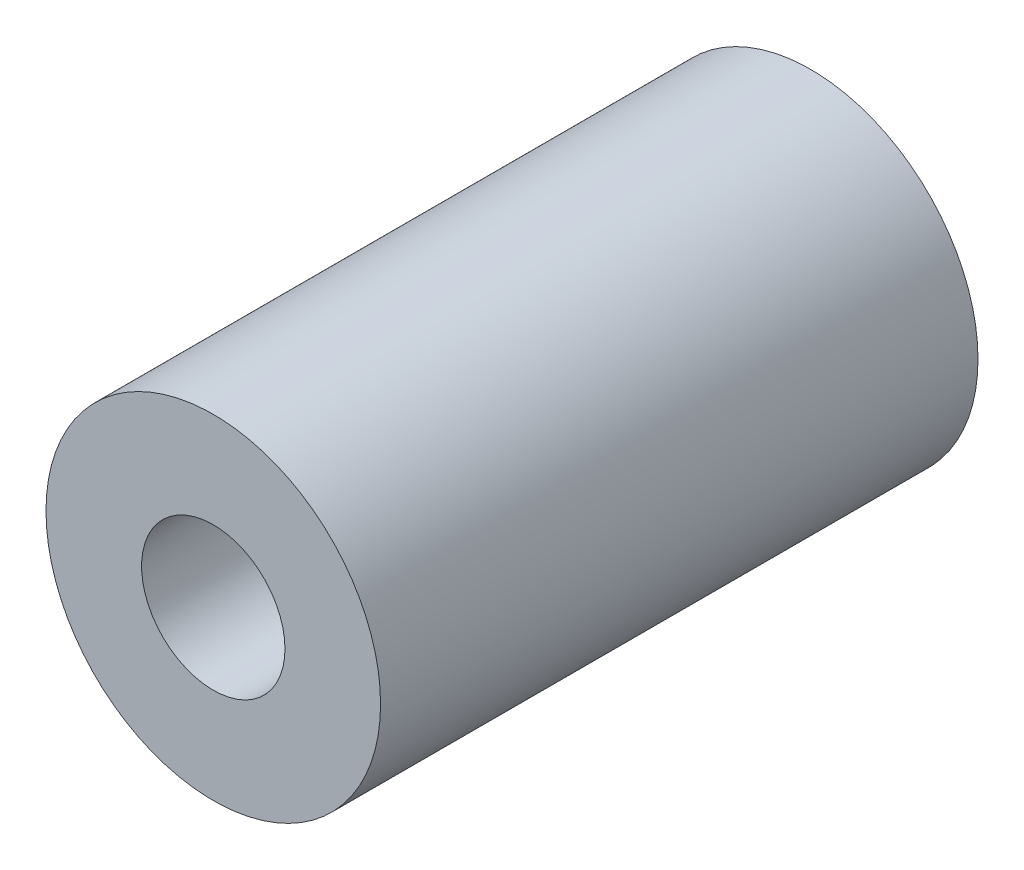
ISO-10303-21;
HEADER;
FILE_DESCRIPTION(('STEP AP214'),'2;1');
FILE_NAME('part.step','',(''),(''),'','','');
FILE_SCHEMA(('AUTOMOTIVE_DESIGN { 1 0 10303 214 1 1 1 1 }'));
ENDSEC;
DATA;
#1=APPLICATION_CONTEXT('core data for automotive mechanical design processes');
#2=APPLICATION_PROTOCOL_DEFINITION('international standard','automotive_design',2000,#1);
#3=PRODUCT_CONTEXT('',#1,'mechanical');
#4=PRODUCT('Part','Part','',(#3));
#5=PRODUCT_RELATED_PRODUCT_CATEGORY('part','',(#4));
#6=PRODUCT_DEFINITION_FORMATION('','',#4);
#7=PRODUCT_DEFINITION_CONTEXT('part definition',#1,'design');
#8=PRODUCT_DEFINITION('design','',#6,#7);
#9=PRODUCT_DEFINITION_SHAPE('','',#8);
#10=(LENGTH_UNIT() NAMED_UNIT(*) SI_UNIT(.MILLI.,.METRE.));
#11=(NAMED_UNIT(*) PLANE_ANGLE_UNIT() SI_UNIT($,.RADIAN.));
#12=(NAMED_UNIT(*) SI_UNIT($,.STERADIAN.) SOLID_ANGLE_UNIT());
#13=UNCERTAINTY_MEASURE_WITH_UNIT(LENGTH_MEASURE(1.E-05),#10,'distance_accuracy_value','');
#14=(GEOMETRIC_REPRESENTATION_CONTEXT(3) GLOBAL_UNCERTAINTY_ASSIGNED_CONTEXT((#13)) GLOBAL_UNIT_ASSIGNED_CONTEXT((#10,
#11,#12)) REPRESENTATION_CONTEXT('',''));
#15=CARTESIAN_POINT('',(0.,0.,0.));
#16=DIRECTION('',(0.,0.,1.));
#17=DIRECTION('',(1.,0.,0.));
#18=AXIS2_PLACEMENT_3D('',#15,#16,#17);
#19=CARTESIAN_POINT('',(0.,0.,25.));
#20=DIRECTION('',(0.,0.,1.));
#21=DIRECTION('',(1.,0.,0.));
#22=AXIS2_PLACEMENT_3D('',#19,#20,#21);
#23=PLANE('',#22);
#24=CARTESIAN_POINT('',(0.,0.,25.));
#25=DIRECTION('',(0.,0.,1.));
#26=DIRECTION('',(1.,0.,0.));
#27=AXIS2_PLACEMENT_3D('',#24,#25,#26);
#28=CIRCLE('',#27,7.);
#29=CARTESIAN_POINT('',(7.,0.,25.));
#30=VERTEX_POINT('',#29);
#31=EDGE_CURVE('E10',#30,#30,#28,.T.);
#32=ORIENTED_EDGE('',*,*,#31,.T.);
#33=EDGE_LOOP('',(#32));
#34=FACE_BOUND('',#33,.T.);
#35=CARTESIAN_POINT('',(0.,0.,25.));
#36=DIRECTION('',(0.,0.,1.));
#37=DIRECTION('',(1.,0.,0.));
#38=AXIS2_PLACEMENT_3D('',#35,#36,#37);
#39=CIRCLE('',#38,3.);
#40=CARTESIAN_POINT('',(3.,0.,25.));
#41=VERTEX_POINT('',#40);
#42=EDGE_CURVE('E45',#41,#41,#39,.T.);
#43=ORIENTED_EDGE('',*,*,#42,.F.);
#44=EDGE_LOOP('',(#43));
#45=FACE_BOUND('',#44,.T.);
#46=ADVANCED_FACE('F34',(#34,#45),#23,.T.);
#47=CARTESIAN_POINT('',(0.,0.,0.));
#48=DIRECTION('',(0.,0.,1.));
#49=DIRECTION('',(1.,0.,0.));
#50=AXIS2_PLACEMENT_3D('',#47,#48,#49);
#51=PLANE('',#50);
#52=CARTESIAN_POINT('',(0.,0.,0.));
#53=DIRECTION('',(0.,0.,1.));
#54=DIRECTION('',(1.,0.,0.));
#55=AXIS2_PLACEMENT_3D('',#52,#53,#54);
#56=CIRCLE('',#55,7.);
#57=CARTESIAN_POINT('',(7.,0.,0.));
#58=VERTEX_POINT('',#57);
#59=EDGE_CURVE('E38',#58,#58,#56,.T.);
#60=ORIENTED_EDGE('',*,*,#59,.F.);
#61=EDGE_LOOP('',(#60));
#62=FACE_BOUND('',#61,.T.);
#63=CARTESIAN_POINT('',(0.,0.,0.));
#64=DIRECTION('',(0.,0.,1.));
#65=DIRECTION('',(1.,0.,0.));
#66=AXIS2_PLACEMENT_3D('',#63,#64,#65);
#67=CIRCLE('',#66,3.);
#68=CARTESIAN_POINT('',(3.,0.,0.));
#69=VERTEX_POINT('',#68);
#70=EDGE_CURVE('E47',#69,#69,#67,.T.);
#71=ORIENTED_EDGE('',*,*,#70,.T.);
#72=EDGE_LOOP('',(#71));
#73=FACE_BOUND('',#72,.T.);
#74=ADVANCED_FACE('F57',(#62,#73),#51,.F.);
#75=CARTESIAN_POINT('',(0.,0.,25.));
#76=DIRECTION('',(0.,0.,-1.));
#77=DIRECTION('',(-1.,0.,0.));
#78=AXIS2_PLACEMENT_3D('',#75,#76,#77);
#79=CYLINDRICAL_SURFACE('',#78,7.);
#80=ORIENTED_EDGE('',*,*,#31,.F.);
#81=EDGE_LOOP('',(#80));
#82=FACE_BOUND('',#81,.T.);
#83=ORIENTED_EDGE('',*,*,#59,.T.);
#84=EDGE_LOOP('',(#83));
#85=FACE_BOUND('',#84,.T.);
#86=ADVANCED_FACE('F36',(#82,#85),#79,.T.);
#87=CARTESIAN_POINT('',(0.,0.,25.));
#88=DIRECTION('',(0.,0.,-1.));
#89=DIRECTION('',(-1.,0.,0.));
#90=AXIS2_PLACEMENT_3D('',#87,#88,#89);
#91=CYLINDRICAL_SURFACE('',#90,3.);
#92=ORIENTED_EDGE('',*,*,#42,.T.);
#93=EDGE_LOOP('',(#92));
#94=FACE_BOUND('',#93,.T.);
#95=ORIENTED_EDGE('',*,*,#70,.F.);
#96=EDGE_LOOP('',(#95));
#97=FACE_BOUND('',#96,.T.);
#98=ADVANCED_FACE('F53',(#94,#97),#91,.F.);
#99=CLOSED_SHELL('',(#46,#74,#86,#98));
#100=MANIFOLD_SOLID_BREP('B2',#99);
#101=ADVANCED_BREP_SHAPE_REPRESENTATION('',(#18,#100),#14);
#102=SHAPE_DEFINITION_REPRESENTATION(#9,#101);
ENDSEC;
END-ISO-10303-21;
